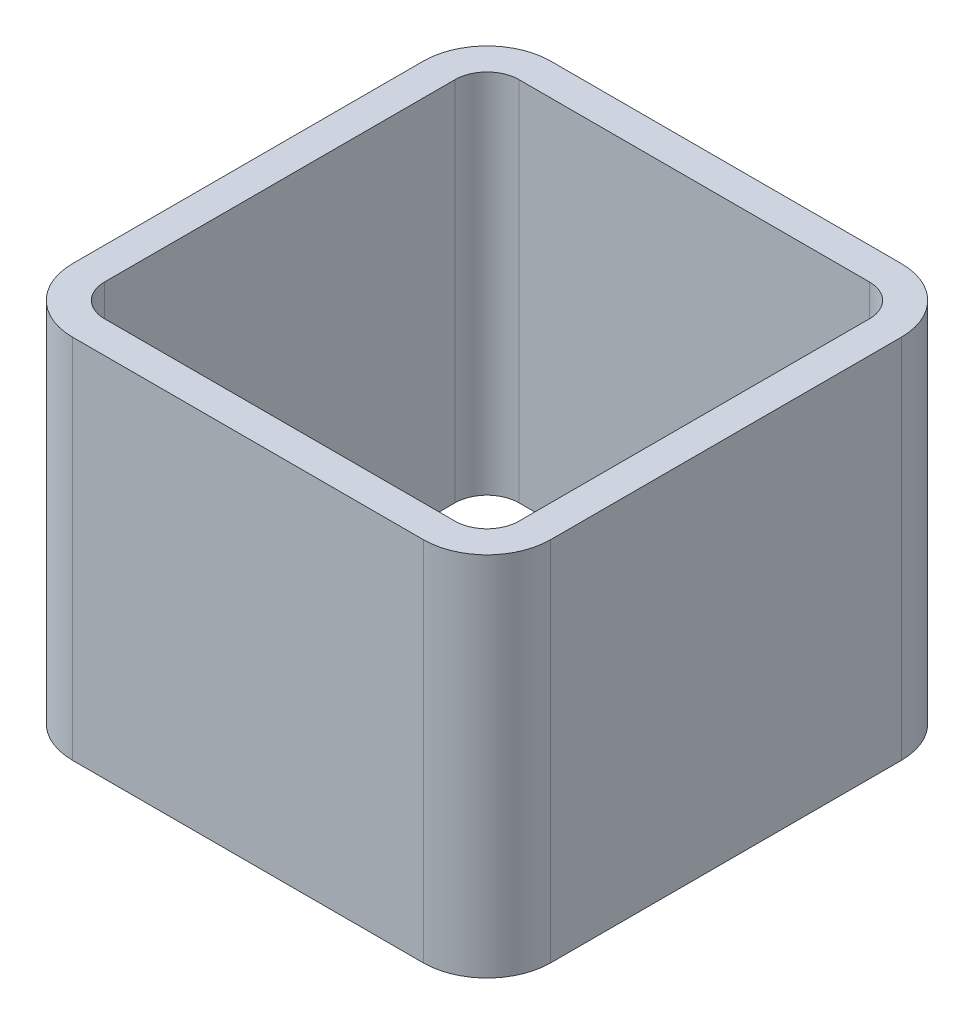
ISO-10303-21;
HEADER;
FILE_DESCRIPTION(('STEP AP214'),'2;1');
FILE_NAME('part.step','',(''),(''),'','','');
FILE_SCHEMA(('AUTOMOTIVE_DESIGN { 1 0 10303 214 1 1 1 1 }'));
ENDSEC;
DATA;
#1=APPLICATION_CONTEXT('core data for automotive mechanical design processes');
#2=APPLICATION_PROTOCOL_DEFINITION('international standard','automotive_design',2000,#1);
#3=PRODUCT_CONTEXT('',#1,'mechanical');
#4=PRODUCT('Part','Part','',(#3));
#5=PRODUCT_RELATED_PRODUCT_CATEGORY('part','',(#4));
#6=PRODUCT_DEFINITION_FORMATION('','',#4);
#7=PRODUCT_DEFINITION_CONTEXT('part definition',#1,'design');
#8=PRODUCT_DEFINITION('design','',#6,#7);
#9=PRODUCT_DEFINITION_SHAPE('','',#8);
#10=(LENGTH_UNIT() NAMED_UNIT(*) SI_UNIT(.MILLI.,.METRE.));
#11=(NAMED_UNIT(*) PLANE_ANGLE_UNIT() SI_UNIT($,.RADIAN.));
#12=(NAMED_UNIT(*) SI_UNIT($,.STERADIAN.) SOLID_ANGLE_UNIT());
#13=UNCERTAINTY_MEASURE_WITH_UNIT(LENGTH_MEASURE(1.E-05),#10,'distance_accuracy_value','');
#14=(GEOMETRIC_REPRESENTATION_CONTEXT(3) GLOBAL_UNCERTAINTY_ASSIGNED_CONTEXT((#13)) GLOBAL_UNIT_ASSIGNED_CONTEXT((#10,
#11,#12)) REPRESENTATION_CONTEXT('',''));
#15=CARTESIAN_POINT('',(0.,0.,0.));
#16=DIRECTION('',(0.,0.,1.));
#17=DIRECTION('',(1.,0.,0.));
#18=AXIS2_PLACEMENT_3D('',#15,#16,#17);
#19=CARTESIAN_POINT('',(-11.,11.5,11.));
#20=DIRECTION('',(0.,-1.,0.));
#21=DIRECTION('',(0.,0.,-1.));
#22=AXIS2_PLACEMENT_3D('',#19,#20,#21);
#23=PLANE('',#22);
#24=CARTESIAN_POINT('',(-11.,11.5,11.));
#25=DIRECTION('',(0.,1.,0.));
#26=DIRECTION('',(0.,0.,-1.));
#27=AXIS2_PLACEMENT_3D('',#24,#25,#26);
#28=CIRCLE('',#27,4.);
#29=CARTESIAN_POINT('',(-15.,11.5,11.));
#30=VERTEX_POINT('',#29);
#31=CARTESIAN_POINT('',(-11.,11.5,15.));
#32=VERTEX_POINT('',#31);
#33=EDGE_CURVE('E212',#30,#32,#28,.T.);
#34=ORIENTED_EDGE('',*,*,#33,.T.);
#35=DIRECTION('',(1.,0.,0.));
#36=VECTOR('',#35,1.);
#37=CARTESIAN_POINT('',(-11.,11.5,15.));
#38=LINE('',#37,#36);
#39=CARTESIAN_POINT('',(11.,11.5,15.));
#40=VERTEX_POINT('',#39);
#41=EDGE_CURVE('E215',#32,#40,#38,.T.);
#42=ORIENTED_EDGE('',*,*,#41,.T.);
#43=CARTESIAN_POINT('',(11.,11.5,11.));
#44=DIRECTION('',(0.,1.,0.));
#45=DIRECTION('',(0.,0.,1.));
#46=AXIS2_PLACEMENT_3D('',#43,#44,#45);
#47=CIRCLE('',#46,4.);
#48=CARTESIAN_POINT('',(15.,11.5,11.));
#49=VERTEX_POINT('',#48);
#50=EDGE_CURVE('E218',#40,#49,#47,.T.);
#51=ORIENTED_EDGE('',*,*,#50,.T.);
#52=DIRECTION('',(0.,0.,-1.));
#53=VECTOR('',#52,1.);
#54=CARTESIAN_POINT('',(15.,11.5,11.));
#55=LINE('',#54,#53);
#56=CARTESIAN_POINT('',(15.,11.5,-11.));
#57=VERTEX_POINT('',#56);
#58=EDGE_CURVE('E220',#49,#57,#55,.T.);
#59=ORIENTED_EDGE('',*,*,#58,.T.);
#60=CARTESIAN_POINT('',(11.,11.5,-11.));
#61=DIRECTION('',(0.,1.,0.));
#62=DIRECTION('',(0.,0.,-1.));
#63=AXIS2_PLACEMENT_3D('',#60,#61,#62);
#64=CIRCLE('',#63,4.);
#65=CARTESIAN_POINT('',(11.,11.5,-15.));
#66=VERTEX_POINT('',#65);
#67=EDGE_CURVE('E222',#57,#66,#64,.T.);
#68=ORIENTED_EDGE('',*,*,#67,.T.);
#69=DIRECTION('',(-1.,0.,0.));
#70=VECTOR('',#69,1.);
#71=CARTESIAN_POINT('',(-11.,11.5,-15.));
#72=LINE('',#71,#70);
#73=CARTESIAN_POINT('',(-11.,11.5,-15.));
#74=VERTEX_POINT('',#73);
#75=EDGE_CURVE('E224',#66,#74,#72,.T.);
#76=ORIENTED_EDGE('',*,*,#75,.T.);
#77=CARTESIAN_POINT('',(-11.,11.5,-11.));
#78=DIRECTION('',(0.,1.,0.));
#79=DIRECTION('',(0.,0.,-1.));
#80=AXIS2_PLACEMENT_3D('',#77,#78,#79);
#81=CIRCLE('',#80,4.);
#82=CARTESIAN_POINT('',(-15.,11.5,-11.));
#83=VERTEX_POINT('',#82);
#84=EDGE_CURVE('E226',#74,#83,#81,.T.);
#85=ORIENTED_EDGE('',*,*,#84,.T.);
#86=DIRECTION('',(0.,0.,1.));
#87=VECTOR('',#86,1.);
#88=CARTESIAN_POINT('',(-15.,11.5,11.));
#89=LINE('',#88,#87);
#90=EDGE_CURVE('E228',#83,#30,#89,.T.);
#91=ORIENTED_EDGE('',*,*,#90,.T.);
#92=EDGE_LOOP('',(#34,#42,#51,#59,#68,#76,#85,#91));
#93=FACE_BOUND('',#92,.T.);
#94=CARTESIAN_POINT('',(-11.,11.5,11.));
#95=DIRECTION('',(0.,1.,0.));
#96=DIRECTION('',(0.,0.,-1.));
#97=AXIS2_PLACEMENT_3D('',#94,#95,#96);
#98=CIRCLE('',#97,2.);
#99=CARTESIAN_POINT('',(-13.,11.5,11.));
#100=VERTEX_POINT('',#99);
#101=CARTESIAN_POINT('',(-11.,11.5,13.));
#102=VERTEX_POINT('',#101);
#103=EDGE_CURVE('E147',#100,#102,#98,.T.);
#104=ORIENTED_EDGE('',*,*,#103,.F.);
#105=DIRECTION('',(0.,0.,1.));
#106=VECTOR('',#105,1.);
#107=CARTESIAN_POINT('',(-13.,11.5,11.));
#108=LINE('',#107,#106);
#109=CARTESIAN_POINT('',(-13.,11.5,-11.));
#110=VERTEX_POINT('',#109);
#111=EDGE_CURVE('E180',#110,#100,#108,.T.);
#112=ORIENTED_EDGE('',*,*,#111,.F.);
#113=CARTESIAN_POINT('',(-11.,11.5,-11.));
#114=DIRECTION('',(0.,1.,0.));
#115=DIRECTION('',(0.,0.,-1.));
#116=AXIS2_PLACEMENT_3D('',#113,#114,#115);
#117=CIRCLE('',#116,2.);
#118=CARTESIAN_POINT('',(-11.,11.5,-13.));
#119=VERTEX_POINT('',#118);
#120=EDGE_CURVE('E178',#119,#110,#117,.T.);
#121=ORIENTED_EDGE('',*,*,#120,.F.);
#122=DIRECTION('',(-1.,0.,0.));
#123=VECTOR('',#122,1.);
#124=CARTESIAN_POINT('',(-11.,11.5,-13.));
#125=LINE('',#124,#123);
#126=CARTESIAN_POINT('',(11.,11.5,-13.));
#127=VERTEX_POINT('',#126);
#128=EDGE_CURVE('E176',#127,#119,#125,.T.);
#129=ORIENTED_EDGE('',*,*,#128,.F.);
#130=CARTESIAN_POINT('',(11.,11.5,-11.));
#131=DIRECTION('',(0.,1.,0.));
#132=DIRECTION('',(0.,0.,-1.));
#133=AXIS2_PLACEMENT_3D('',#130,#131,#132);
#134=CIRCLE('',#133,2.);
#135=CARTESIAN_POINT('',(13.,11.5,-11.));
#136=VERTEX_POINT('',#135);
#137=EDGE_CURVE('E174',#136,#127,#134,.T.);
#138=ORIENTED_EDGE('',*,*,#137,.F.);
#139=DIRECTION('',(0.,0.,-1.));
#140=VECTOR('',#139,1.);
#141=CARTESIAN_POINT('',(13.,11.5,11.));
#142=LINE('',#141,#140);
#143=CARTESIAN_POINT('',(13.,11.5,11.));
#144=VERTEX_POINT('',#143);
#145=EDGE_CURVE('E170',#144,#136,#142,.T.);
#146=ORIENTED_EDGE('',*,*,#145,.F.);
#147=CARTESIAN_POINT('',(11.,11.5,11.));
#148=DIRECTION('',(0.,1.,0.));
#149=DIRECTION('',(0.,0.,1.));
#150=AXIS2_PLACEMENT_3D('',#147,#148,#149);
#151=CIRCLE('',#150,2.);
#152=CARTESIAN_POINT('',(11.,11.5,13.));
#153=VERTEX_POINT('',#152);
#154=EDGE_CURVE('E168',#153,#144,#151,.T.);
#155=ORIENTED_EDGE('',*,*,#154,.F.);
#156=DIRECTION('',(1.,0.,0.));
#157=VECTOR('',#156,1.);
#158=CARTESIAN_POINT('',(-11.,11.5,13.));
#159=LINE('',#158,#157);
#160=EDGE_CURVE('E155',#102,#153,#159,.T.);
#161=ORIENTED_EDGE('',*,*,#160,.F.);
#162=EDGE_LOOP('',(#104,#112,#121,#129,#138,#146,#155,#161));
#163=FACE_BOUND('',#162,.T.);
#164=ADVANCED_FACE('F34',(#93,#163),#23,.F.);
#165=CARTESIAN_POINT('',(-11.,-11.5,11.));
#166=DIRECTION('',(0.,-1.,0.));
#167=DIRECTION('',(0.,0.,-1.));
#168=AXIS2_PLACEMENT_3D('',#165,#166,#167);
#169=PLANE('',#168);
#170=CARTESIAN_POINT('',(-11.,-11.5,11.));
#171=DIRECTION('',(0.,1.,0.));
#172=DIRECTION('',(0.,0.,-1.));
#173=AXIS2_PLACEMENT_3D('',#170,#171,#172);
#174=CIRCLE('',#173,4.);
#175=CARTESIAN_POINT('',(-15.,-11.5,11.));
#176=VERTEX_POINT('',#175);
#177=CARTESIAN_POINT('',(-11.,-11.5,15.));
#178=VERTEX_POINT('',#177);
#179=EDGE_CURVE('E163',#176,#178,#174,.T.);
#180=ORIENTED_EDGE('',*,*,#179,.F.);
#181=DIRECTION('',(0.,0.,1.));
#182=VECTOR('',#181,1.);
#183=CARTESIAN_POINT('',(-15.,-11.5,11.));
#184=LINE('',#183,#182);
#185=CARTESIAN_POINT('',(-15.,-11.5,-11.));
#186=VERTEX_POINT('',#185);
#187=EDGE_CURVE('E216',#186,#176,#184,.T.);
#188=ORIENTED_EDGE('',*,*,#187,.F.);
#189=CARTESIAN_POINT('',(-11.,-11.5,-11.));
#190=DIRECTION('',(0.,1.,0.));
#191=DIRECTION('',(0.,0.,-1.));
#192=AXIS2_PLACEMENT_3D('',#189,#190,#191);
#193=CIRCLE('',#192,4.);
#194=CARTESIAN_POINT('',(-11.,-11.5,-15.));
#195=VERTEX_POINT('',#194);
#196=EDGE_CURVE('E243',#195,#186,#193,.T.);
#197=ORIENTED_EDGE('',*,*,#196,.F.);
#198=DIRECTION('',(-1.,0.,0.));
#199=VECTOR('',#198,1.);
#200=CARTESIAN_POINT('',(-11.,-11.5,-15.));
#201=LINE('',#200,#199);
#202=CARTESIAN_POINT('',(11.,-11.5,-15.));
#203=VERTEX_POINT('',#202);
#204=EDGE_CURVE('E241',#203,#195,#201,.T.);
#205=ORIENTED_EDGE('',*,*,#204,.F.);
#206=CARTESIAN_POINT('',(11.,-11.5,-11.));
#207=DIRECTION('',(0.,1.,0.));
#208=DIRECTION('',(0.,0.,-1.));
#209=AXIS2_PLACEMENT_3D('',#206,#207,#208);
#210=CIRCLE('',#209,4.);
#211=CARTESIAN_POINT('',(15.,-11.5,-11.));
#212=VERTEX_POINT('',#211);
#213=EDGE_CURVE('E239',#212,#203,#210,.T.);
#214=ORIENTED_EDGE('',*,*,#213,.F.);
#215=DIRECTION('',(0.,0.,-1.));
#216=VECTOR('',#215,1.);
#217=CARTESIAN_POINT('',(15.,-11.5,11.));
#218=LINE('',#217,#216);
#219=CARTESIAN_POINT('',(15.,-11.5,11.));
#220=VERTEX_POINT('',#219);
#221=EDGE_CURVE('E237',#220,#212,#218,.T.);
#222=ORIENTED_EDGE('',*,*,#221,.F.);
#223=CARTESIAN_POINT('',(11.,-11.5,11.));
#224=DIRECTION('',(0.,1.,0.));
#225=DIRECTION('',(0.,0.,1.));
#226=AXIS2_PLACEMENT_3D('',#223,#224,#225);
#227=CIRCLE('',#226,4.);
#228=CARTESIAN_POINT('',(11.,-11.5,15.));
#229=VERTEX_POINT('',#228);
#230=EDGE_CURVE('E235',#229,#220,#227,.T.);
#231=ORIENTED_EDGE('',*,*,#230,.F.);
#232=DIRECTION('',(1.,0.,0.));
#233=VECTOR('',#232,1.);
#234=CARTESIAN_POINT('',(-11.,-11.5,15.));
#235=LINE('',#234,#233);
#236=EDGE_CURVE('E233',#178,#229,#235,.T.);
#237=ORIENTED_EDGE('',*,*,#236,.F.);
#238=EDGE_LOOP('',(#180,#188,#197,#205,#214,#222,#231,#237));
#239=FACE_BOUND('',#238,.T.);
#240=DIRECTION('',(0.,0.,1.));
#241=VECTOR('',#240,1.);
#242=CARTESIAN_POINT('',(-13.,-11.5,11.));
#243=LINE('',#242,#241);
#244=CARTESIAN_POINT('',(-13.,-11.5,-11.));
#245=VERTEX_POINT('',#244);
#246=CARTESIAN_POINT('',(-13.,-11.5,11.));
#247=VERTEX_POINT('',#246);
#248=EDGE_CURVE('E156',#245,#247,#243,.T.);
#249=ORIENTED_EDGE('',*,*,#248,.T.);
#250=CARTESIAN_POINT('',(-11.,-11.5,11.));
#251=DIRECTION('',(0.,1.,0.));
#252=DIRECTION('',(0.,0.,-1.));
#253=AXIS2_PLACEMENT_3D('',#250,#251,#252);
#254=CIRCLE('',#253,2.);
#255=CARTESIAN_POINT('',(-11.,-11.5,13.));
#256=VERTEX_POINT('',#255);
#257=EDGE_CURVE('E57',#247,#256,#254,.T.);
#258=ORIENTED_EDGE('',*,*,#257,.T.);
#259=DIRECTION('',(1.,0.,0.));
#260=VECTOR('',#259,1.);
#261=CARTESIAN_POINT('',(-11.,-11.5,13.));
#262=LINE('',#261,#260);
#263=CARTESIAN_POINT('',(11.,-11.5,13.));
#264=VERTEX_POINT('',#263);
#265=EDGE_CURVE('E162',#256,#264,#262,.T.);
#266=ORIENTED_EDGE('',*,*,#265,.T.);
#267=CARTESIAN_POINT('',(11.,-11.5,11.));
#268=DIRECTION('',(0.,1.,0.));
#269=DIRECTION('',(0.,0.,1.));
#270=AXIS2_PLACEMENT_3D('',#267,#268,#269);
#271=CIRCLE('',#270,2.);
#272=CARTESIAN_POINT('',(13.,-11.5,11.));
#273=VERTEX_POINT('',#272);
#274=EDGE_CURVE('E184',#264,#273,#271,.T.);
#275=ORIENTED_EDGE('',*,*,#274,.T.);
#276=DIRECTION('',(0.,0.,-1.));
#277=VECTOR('',#276,1.);
#278=CARTESIAN_POINT('',(13.,-11.5,11.));
#279=LINE('',#278,#277);
#280=CARTESIAN_POINT('',(13.,-11.5,-11.));
#281=VERTEX_POINT('',#280);
#282=EDGE_CURVE('E187',#273,#281,#279,.T.);
#283=ORIENTED_EDGE('',*,*,#282,.T.);
#284=CARTESIAN_POINT('',(11.,-11.5,-11.));
#285=DIRECTION('',(0.,1.,0.));
#286=DIRECTION('',(0.,0.,-1.));
#287=AXIS2_PLACEMENT_3D('',#284,#285,#286);
#288=CIRCLE('',#287,2.);
#289=CARTESIAN_POINT('',(11.,-11.5,-13.));
#290=VERTEX_POINT('',#289);
#291=EDGE_CURVE('E190',#281,#290,#288,.T.);
#292=ORIENTED_EDGE('',*,*,#291,.T.);
#293=DIRECTION('',(-1.,0.,0.));
#294=VECTOR('',#293,1.);
#295=CARTESIAN_POINT('',(-11.,-11.5,-13.));
#296=LINE('',#295,#294);
#297=CARTESIAN_POINT('',(-11.,-11.5,-13.));
#298=VERTEX_POINT('',#297);
#299=EDGE_CURVE('E193',#290,#298,#296,.T.);
#300=ORIENTED_EDGE('',*,*,#299,.T.);
#301=CARTESIAN_POINT('',(-11.,-11.5,-11.));
#302=DIRECTION('',(0.,1.,0.));
#303=DIRECTION('',(0.,0.,-1.));
#304=AXIS2_PLACEMENT_3D('',#301,#302,#303);
#305=CIRCLE('',#304,2.);
#306=EDGE_CURVE('E196',#298,#245,#305,.T.);
#307=ORIENTED_EDGE('',*,*,#306,.T.);
#308=EDGE_LOOP('',(#249,#258,#266,#275,#283,#292,#300,#307));
#309=FACE_BOUND('',#308,.T.);
#310=ADVANCED_FACE('F273',(#239,#309),#169,.T.);
#311=CARTESIAN_POINT('',(-11.,11.5,11.));
#312=DIRECTION('',(0.,-1.,0.));
#313=DIRECTION('',(0.,0.,-1.));
#314=AXIS2_PLACEMENT_3D('',#311,#312,#313);
#315=CYLINDRICAL_SURFACE('',#314,4.);
#316=ORIENTED_EDGE('',*,*,#179,.T.);
#317=DIRECTION('',(0.,-1.,0.));
#318=VECTOR('',#317,1.);
#319=CARTESIAN_POINT('',(-11.,11.5,15.));
#320=LINE('',#319,#318);
#321=EDGE_CURVE('E11',#32,#178,#320,.T.);
#322=ORIENTED_EDGE('',*,*,#321,.F.);
#323=ORIENTED_EDGE('',*,*,#33,.F.);
#324=DIRECTION('',(0.,-1.,0.));
#325=VECTOR('',#324,1.);
#326=CARTESIAN_POINT('',(-15.,11.5,11.));
#327=LINE('',#326,#325);
#328=EDGE_CURVE('E230',#30,#176,#327,.T.);
#329=ORIENTED_EDGE('',*,*,#328,.T.);
#330=EDGE_LOOP('',(#316,#322,#323,#329));
#331=FACE_BOUND('',#330,.T.);
#332=ADVANCED_FACE('F36',(#331),#315,.T.);
#333=CARTESIAN_POINT('',(-11.,11.5,15.));
#334=DIRECTION('',(0.,0.,-1.));
#335=DIRECTION('',(-1.,0.,0.));
#336=AXIS2_PLACEMENT_3D('',#333,#334,#335);
#337=PLANE('',#336);
#338=ORIENTED_EDGE('',*,*,#236,.T.);
#339=DIRECTION('',(0.,-1.,0.));
#340=VECTOR('',#339,1.);
#341=CARTESIAN_POINT('',(11.,11.5,15.));
#342=LINE('',#341,#340);
#343=EDGE_CURVE('E42',#40,#229,#342,.T.);
#344=ORIENTED_EDGE('',*,*,#343,.F.);
#345=ORIENTED_EDGE('',*,*,#41,.F.);
#346=ORIENTED_EDGE('',*,*,#321,.T.);
#347=EDGE_LOOP('',(#338,#344,#345,#346));
#348=FACE_BOUND('',#347,.T.);
#349=ADVANCED_FACE('F290',(#348),#337,.F.);
#350=CARTESIAN_POINT('',(11.,11.5,11.));
#351=DIRECTION('',(0.,-1.,0.));
#352=DIRECTION('',(0.,0.,-1.));
#353=AXIS2_PLACEMENT_3D('',#350,#351,#352);
#354=CYLINDRICAL_SURFACE('',#353,4.);
#355=ORIENTED_EDGE('',*,*,#230,.T.);
#356=DIRECTION('',(0.,-1.,0.));
#357=VECTOR('',#356,1.);
#358=CARTESIAN_POINT('',(15.,11.5,11.));
#359=LINE('',#358,#357);
#360=EDGE_CURVE('E260',#49,#220,#359,.T.);
#361=ORIENTED_EDGE('',*,*,#360,.F.);
#362=ORIENTED_EDGE('',*,*,#50,.F.);
#363=ORIENTED_EDGE('',*,*,#343,.T.);
#364=EDGE_LOOP('',(#355,#361,#362,#363));
#365=FACE_BOUND('',#364,.T.);
#366=ADVANCED_FACE('F267',(#365),#354,.T.);
#367=CARTESIAN_POINT('',(15.,11.5,11.));
#368=DIRECTION('',(-1.,0.,0.));
#369=DIRECTION('',(0.,0.,1.));
#370=AXIS2_PLACEMENT_3D('',#367,#368,#369);
#371=PLANE('',#370);
#372=ORIENTED_EDGE('',*,*,#221,.T.);
#373=DIRECTION('',(0.,-1.,0.));
#374=VECTOR('',#373,1.);
#375=CARTESIAN_POINT('',(15.,11.5,-11.));
#376=LINE('',#375,#374);
#377=EDGE_CURVE('E257',#57,#212,#376,.T.);
#378=ORIENTED_EDGE('',*,*,#377,.F.);
#379=ORIENTED_EDGE('',*,*,#58,.F.);
#380=ORIENTED_EDGE('',*,*,#360,.T.);
#381=EDGE_LOOP('',(#372,#378,#379,#380));
#382=FACE_BOUND('',#381,.T.);
#383=ADVANCED_FACE('F279',(#382),#371,.F.);
#384=CARTESIAN_POINT('',(11.,11.5,-11.));
#385=DIRECTION('',(0.,-1.,0.));
#386=DIRECTION('',(0.,0.,-1.));
#387=AXIS2_PLACEMENT_3D('',#384,#385,#386);
#388=CYLINDRICAL_SURFACE('',#387,4.);
#389=ORIENTED_EDGE('',*,*,#213,.T.);
#390=DIRECTION('',(0.,-1.,0.));
#391=VECTOR('',#390,1.);
#392=CARTESIAN_POINT('',(11.,11.5,-15.));
#393=LINE('',#392,#391);
#394=EDGE_CURVE('E254',#66,#203,#393,.T.);
#395=ORIENTED_EDGE('',*,*,#394,.F.);
#396=ORIENTED_EDGE('',*,*,#67,.F.);
#397=ORIENTED_EDGE('',*,*,#377,.T.);
#398=EDGE_LOOP('',(#389,#395,#396,#397));
#399=FACE_BOUND('',#398,.T.);
#400=ADVANCED_FACE('F283',(#399),#388,.T.);
#401=CARTESIAN_POINT('',(-11.,11.5,-15.));
#402=DIRECTION('',(0.,0.,1.));
#403=DIRECTION('',(1.,0.,0.));
#404=AXIS2_PLACEMENT_3D('',#401,#402,#403);
#405=PLANE('',#404);
#406=ORIENTED_EDGE('',*,*,#204,.T.);
#407=DIRECTION('',(0.,-1.,0.));
#408=VECTOR('',#407,1.);
#409=CARTESIAN_POINT('',(-11.,11.5,-15.));
#410=LINE('',#409,#408);
#411=EDGE_CURVE('E251',#74,#195,#410,.T.);
#412=ORIENTED_EDGE('',*,*,#411,.F.);
#413=ORIENTED_EDGE('',*,*,#75,.F.);
#414=ORIENTED_EDGE('',*,*,#394,.T.);
#415=EDGE_LOOP('',(#406,#412,#413,#414));
#416=FACE_BOUND('',#415,.T.);
#417=ADVANCED_FACE('F303',(#416),#405,.F.);
#418=CARTESIAN_POINT('',(-11.,11.5,-11.));
#419=DIRECTION('',(0.,-1.,0.));
#420=DIRECTION('',(0.,0.,-1.));
#421=AXIS2_PLACEMENT_3D('',#418,#419,#420);
#422=CYLINDRICAL_SURFACE('',#421,4.);
#423=ORIENTED_EDGE('',*,*,#196,.T.);
#424=DIRECTION('',(0.,-1.,0.));
#425=VECTOR('',#424,1.);
#426=CARTESIAN_POINT('',(-15.,11.5,-11.));
#427=LINE('',#426,#425);
#428=EDGE_CURVE('E248',#83,#186,#427,.T.);
#429=ORIENTED_EDGE('',*,*,#428,.F.);
#430=ORIENTED_EDGE('',*,*,#84,.F.);
#431=ORIENTED_EDGE('',*,*,#411,.T.);
#432=EDGE_LOOP('',(#423,#429,#430,#431));
#433=FACE_BOUND('',#432,.T.);
#434=ADVANCED_FACE('F301',(#433),#422,.T.);
#435=CARTESIAN_POINT('',(-15.,11.5,11.));
#436=DIRECTION('',(1.,0.,0.));
#437=DIRECTION('',(0.,0.,-1.));
#438=AXIS2_PLACEMENT_3D('',#435,#436,#437);
#439=PLANE('',#438);
#440=ORIENTED_EDGE('',*,*,#187,.T.);
#441=ORIENTED_EDGE('',*,*,#328,.F.);
#442=ORIENTED_EDGE('',*,*,#90,.F.);
#443=ORIENTED_EDGE('',*,*,#428,.T.);
#444=EDGE_LOOP('',(#440,#441,#442,#443));
#445=FACE_BOUND('',#444,.T.);
#446=ADVANCED_FACE('F296',(#445),#439,.F.);
#447=CARTESIAN_POINT('',(-11.,11.5,11.));
#448=DIRECTION('',(0.,-1.,0.));
#449=DIRECTION('',(0.,0.,-1.));
#450=AXIS2_PLACEMENT_3D('',#447,#448,#449);
#451=CYLINDRICAL_SURFACE('',#450,2.);
#452=ORIENTED_EDGE('',*,*,#257,.F.);
#453=DIRECTION('',(0.,-1.,0.));
#454=VECTOR('',#453,1.);
#455=CARTESIAN_POINT('',(-13.,11.5,11.));
#456=LINE('',#455,#454);
#457=EDGE_CURVE('E151',#100,#247,#456,.T.);
#458=ORIENTED_EDGE('',*,*,#457,.F.);
#459=ORIENTED_EDGE('',*,*,#103,.T.);
#460=DIRECTION('',(0.,-1.,0.));
#461=VECTOR('',#460,1.);
#462=CARTESIAN_POINT('',(-11.,11.5,13.));
#463=LINE('',#462,#461);
#464=EDGE_CURVE('E150',#102,#256,#463,.T.);
#465=ORIENTED_EDGE('',*,*,#464,.T.);
#466=EDGE_LOOP('',(#452,#458,#459,#465));
#467=FACE_BOUND('',#466,.T.);
#468=ADVANCED_FACE('F149',(#467),#451,.F.);
#469=CARTESIAN_POINT('',(-11.,11.5,13.));
#470=DIRECTION('',(0.,0.,-1.));
#471=DIRECTION('',(-1.,0.,0.));
#472=AXIS2_PLACEMENT_3D('',#469,#470,#471);
#473=PLANE('',#472);
#474=ORIENTED_EDGE('',*,*,#265,.F.);
#475=ORIENTED_EDGE('',*,*,#464,.F.);
#476=ORIENTED_EDGE('',*,*,#160,.T.);
#477=DIRECTION('',(0.,-1.,0.));
#478=VECTOR('',#477,1.);
#479=CARTESIAN_POINT('',(11.,11.5,13.));
#480=LINE('',#479,#478);
#481=EDGE_CURVE('E164',#153,#264,#480,.T.);
#482=ORIENTED_EDGE('',*,*,#481,.T.);
#483=EDGE_LOOP('',(#474,#475,#476,#482));
#484=FACE_BOUND('',#483,.T.);
#485=ADVANCED_FACE('F159',(#484),#473,.T.);
#486=CARTESIAN_POINT('',(11.,11.5,11.));
#487=DIRECTION('',(0.,-1.,0.));
#488=DIRECTION('',(0.,0.,-1.));
#489=AXIS2_PLACEMENT_3D('',#486,#487,#488);
#490=CYLINDRICAL_SURFACE('',#489,2.);
#491=ORIENTED_EDGE('',*,*,#274,.F.);
#492=ORIENTED_EDGE('',*,*,#481,.F.);
#493=ORIENTED_EDGE('',*,*,#154,.T.);
#494=DIRECTION('',(0.,-1.,0.));
#495=VECTOR('',#494,1.);
#496=CARTESIAN_POINT('',(13.,11.5,11.));
#497=LINE('',#496,#495);
#498=EDGE_CURVE('E209',#144,#273,#497,.T.);
#499=ORIENTED_EDGE('',*,*,#498,.T.);
#500=EDGE_LOOP('',(#491,#492,#493,#499));
#501=FACE_BOUND('',#500,.T.);
#502=ADVANCED_FACE('F328',(#501),#490,.F.);
#503=CARTESIAN_POINT('',(13.,11.5,11.));
#504=DIRECTION('',(-1.,0.,0.));
#505=DIRECTION('',(0.,0.,1.));
#506=AXIS2_PLACEMENT_3D('',#503,#504,#505);
#507=PLANE('',#506);
#508=ORIENTED_EDGE('',*,*,#282,.F.);
#509=ORIENTED_EDGE('',*,*,#498,.F.);
#510=ORIENTED_EDGE('',*,*,#145,.T.);
#511=DIRECTION('',(0.,-1.,0.));
#512=VECTOR('',#511,1.);
#513=CARTESIAN_POINT('',(13.,11.5,-11.));
#514=LINE('',#513,#512);
#515=EDGE_CURVE('E207',#136,#281,#514,.T.);
#516=ORIENTED_EDGE('',*,*,#515,.T.);
#517=EDGE_LOOP('',(#508,#509,#510,#516));
#518=FACE_BOUND('',#517,.T.);
#519=ADVANCED_FACE('F332',(#518),#507,.T.);
#520=CARTESIAN_POINT('',(11.,11.5,-11.));
#521=DIRECTION('',(0.,-1.,0.));
#522=DIRECTION('',(0.,0.,-1.));
#523=AXIS2_PLACEMENT_3D('',#520,#521,#522);
#524=CYLINDRICAL_SURFACE('',#523,2.);
#525=ORIENTED_EDGE('',*,*,#291,.F.);
#526=ORIENTED_EDGE('',*,*,#515,.F.);
#527=ORIENTED_EDGE('',*,*,#137,.T.);
#528=DIRECTION('',(0.,-1.,0.));
#529=VECTOR('',#528,1.);
#530=CARTESIAN_POINT('',(11.,11.5,-13.));
#531=LINE('',#530,#529);
#532=EDGE_CURVE('E205',#127,#290,#531,.T.);
#533=ORIENTED_EDGE('',*,*,#532,.T.);
#534=EDGE_LOOP('',(#525,#526,#527,#533));
#535=FACE_BOUND('',#534,.T.);
#536=ADVANCED_FACE('F338',(#535),#524,.F.);
#537=CARTESIAN_POINT('',(-11.,11.5,-13.));
#538=DIRECTION('',(0.,0.,1.));
#539=DIRECTION('',(1.,0.,0.));
#540=AXIS2_PLACEMENT_3D('',#537,#538,#539);
#541=PLANE('',#540);
#542=ORIENTED_EDGE('',*,*,#299,.F.);
#543=ORIENTED_EDGE('',*,*,#532,.F.);
#544=ORIENTED_EDGE('',*,*,#128,.T.);
#545=DIRECTION('',(0.,-1.,0.));
#546=VECTOR('',#545,1.);
#547=CARTESIAN_POINT('',(-11.,11.5,-13.));
#548=LINE('',#547,#546);
#549=EDGE_CURVE('E203',#119,#298,#548,.T.);
#550=ORIENTED_EDGE('',*,*,#549,.T.);
#551=EDGE_LOOP('',(#542,#543,#544,#550));
#552=FACE_BOUND('',#551,.T.);
#553=ADVANCED_FACE('F342',(#552),#541,.T.);
#554=CARTESIAN_POINT('',(-11.,11.5,-11.));
#555=DIRECTION('',(0.,-1.,0.));
#556=DIRECTION('',(0.,0.,-1.));
#557=AXIS2_PLACEMENT_3D('',#554,#555,#556);
#558=CYLINDRICAL_SURFACE('',#557,2.);
#559=ORIENTED_EDGE('',*,*,#306,.F.);
#560=ORIENTED_EDGE('',*,*,#549,.F.);
#561=ORIENTED_EDGE('',*,*,#120,.T.);
#562=DIRECTION('',(0.,-1.,0.));
#563=VECTOR('',#562,1.);
#564=CARTESIAN_POINT('',(-13.,11.5,-11.));
#565=LINE('',#564,#563);
#566=EDGE_CURVE('E49',#110,#245,#565,.T.);
#567=ORIENTED_EDGE('',*,*,#566,.T.);
#568=EDGE_LOOP('',(#559,#560,#561,#567));
#569=FACE_BOUND('',#568,.T.);
#570=ADVANCED_FACE('F346',(#569),#558,.F.);
#571=CARTESIAN_POINT('',(-13.,11.5,11.));
#572=DIRECTION('',(1.,0.,0.));
#573=DIRECTION('',(0.,0.,-1.));
#574=AXIS2_PLACEMENT_3D('',#571,#572,#573);
#575=PLANE('',#574);
#576=ORIENTED_EDGE('',*,*,#248,.F.);
#577=ORIENTED_EDGE('',*,*,#566,.F.);
#578=ORIENTED_EDGE('',*,*,#111,.T.);
#579=ORIENTED_EDGE('',*,*,#457,.T.);
#580=EDGE_LOOP('',(#576,#577,#578,#579));
#581=FACE_BOUND('',#580,.T.);
#582=ADVANCED_FACE('F350',(#581),#575,.T.);
#583=CLOSED_SHELL('',(#164,#310,#332,#349,#366,#383,#400,#417,#434,#446,#468,#485,#502,#519,
#536,#553,#570,#582));
#584=MANIFOLD_SOLID_BREP('B2',#583);
#585=ADVANCED_BREP_SHAPE_REPRESENTATION('',(#18,#584),#14);
#586=SHAPE_DEFINITION_REPRESENTATION(#9,#585);
ENDSEC;
END-ISO-10303-21;
